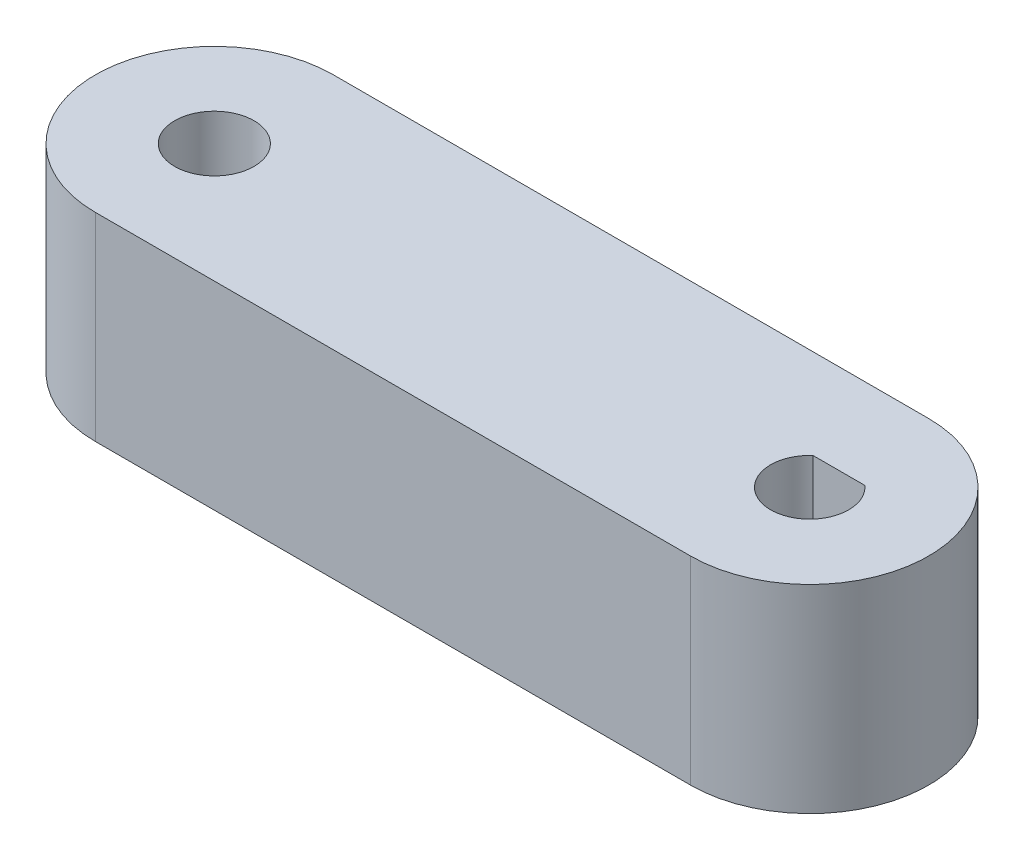
ISO-10303-21;
HEADER;
FILE_DESCRIPTION(('STEP AP214'),'2;1');
FILE_NAME('part.step','',(''),(''),'','','');
FILE_SCHEMA(('AUTOMOTIVE_DESIGN { 1 0 10303 214 1 1 1 1 }'));
ENDSEC;
DATA;
#1=APPLICATION_CONTEXT('core data for automotive mechanical design processes');
#2=APPLICATION_PROTOCOL_DEFINITION('international standard','automotive_design',2000,#1);
#3=PRODUCT_CONTEXT('',#1,'mechanical');
#4=PRODUCT('Part','Part','',(#3));
#5=PRODUCT_RELATED_PRODUCT_CATEGORY('part','',(#4));
#6=PRODUCT_DEFINITION_FORMATION('','',#4);
#7=PRODUCT_DEFINITION_CONTEXT('part definition',#1,'design');
#8=PRODUCT_DEFINITION('design','',#6,#7);
#9=PRODUCT_DEFINITION_SHAPE('','',#8);
#10=(LENGTH_UNIT() NAMED_UNIT(*) SI_UNIT(.MILLI.,.METRE.));
#11=(NAMED_UNIT(*) PLANE_ANGLE_UNIT() SI_UNIT($,.RADIAN.));
#12=(NAMED_UNIT(*) SI_UNIT($,.STERADIAN.) SOLID_ANGLE_UNIT());
#13=UNCERTAINTY_MEASURE_WITH_UNIT(LENGTH_MEASURE(1.E-05),#10,'distance_accuracy_value','');
#14=(GEOMETRIC_REPRESENTATION_CONTEXT(3) GLOBAL_UNCERTAINTY_ASSIGNED_CONTEXT((#13)) GLOBAL_UNIT_ASSIGNED_CONTEXT((#10,
#11,#12)) REPRESENTATION_CONTEXT('',''));
#15=CARTESIAN_POINT('',(0.,0.,0.));
#16=DIRECTION('',(0.,0.,1.));
#17=DIRECTION('',(1.,0.,0.));
#18=AXIS2_PLACEMENT_3D('',#15,#16,#17);
#19=CARTESIAN_POINT('',(-31.75,12.7,0.));
#20=DIRECTION('',(0.,1.,0.));
#21=DIRECTION('',(0.,0.,1.));
#22=AXIS2_PLACEMENT_3D('',#19,#20,#21);
#23=PLANE('',#22);
#24=CARTESIAN_POINT('',(-31.75,12.7,0.));
#25=DIRECTION('',(0.,1.,0.));
#26=DIRECTION('',(0.,0.,1.));
#27=AXIS2_PLACEMENT_3D('',#24,#25,#26);
#28=CIRCLE('',#27,2.54);
#29=CARTESIAN_POINT('',(-31.75,12.7,2.54));
#30=VERTEX_POINT('',#29);
#31=EDGE_CURVE('E107',#30,#30,#28,.T.);
#32=ORIENTED_EDGE('',*,*,#31,.F.);
#33=EDGE_LOOP('',(#32));
#34=FACE_BOUND('',#33,.T.);
#35=CARTESIAN_POINT('',(-31.75,12.7,0.));
#36=DIRECTION('',(0.,1.,0.));
#37=DIRECTION('',(0.,0.,1.));
#38=AXIS2_PLACEMENT_3D('',#35,#36,#37);
#39=CIRCLE('',#38,7.62);
#40=CARTESIAN_POINT('',(-31.75,12.7,-7.62));
#41=VERTEX_POINT('',#40);
#42=CARTESIAN_POINT('',(-31.75,12.7,7.62));
#43=VERTEX_POINT('',#42);
#44=EDGE_CURVE('E115',#41,#43,#39,.T.);
#45=ORIENTED_EDGE('',*,*,#44,.T.);
#46=DIRECTION('',(1.,0.,0.));
#47=VECTOR('',#46,1.);
#48=CARTESIAN_POINT('',(-31.75,12.7,7.62));
#49=LINE('',#48,#47);
#50=CARTESIAN_POINT('',(6.35,12.7,7.62));
#51=VERTEX_POINT('',#50);
#52=EDGE_CURVE('E118',#43,#51,#49,.T.);
#53=ORIENTED_EDGE('',*,*,#52,.T.);
#54=CARTESIAN_POINT('',(6.35,12.7,0.));
#55=DIRECTION('',(0.,1.,0.));
#56=DIRECTION('',(0.,0.,1.));
#57=AXIS2_PLACEMENT_3D('',#54,#55,#56);
#58=CIRCLE('',#57,7.62);
#59=CARTESIAN_POINT('',(6.35,12.7,-7.62));
#60=VERTEX_POINT('',#59);
#61=EDGE_CURVE('E121',#51,#60,#58,.T.);
#62=ORIENTED_EDGE('',*,*,#61,.T.);
#63=DIRECTION('',(-1.,0.,0.));
#64=VECTOR('',#63,1.);
#65=CARTESIAN_POINT('',(-31.75,12.7,-7.62));
#66=LINE('',#65,#64);
#67=EDGE_CURVE('E123',#60,#41,#66,.T.);
#68=ORIENTED_EDGE('',*,*,#67,.T.);
#69=EDGE_LOOP('',(#45,#53,#62,#68));
#70=FACE_BOUND('',#69,.T.);
#71=CARTESIAN_POINT('',(6.35,12.7,0.));
#72=DIRECTION('',(0.,1.,0.));
#73=DIRECTION('',(0.,0.,1.));
#74=AXIS2_PLACEMENT_3D('',#71,#72,#73);
#75=CIRCLE('',#74,2.5);
#76=CARTESIAN_POINT('',(4.69118250984175,12.7,-1.87038085275302));
#77=VERTEX_POINT('',#76);
#78=CARTESIAN_POINT('',(8.00881749015825,12.7,-1.87038085275302));
#79=VERTEX_POINT('',#78);
#80=EDGE_CURVE('E102',#77,#79,#75,.T.);
#81=ORIENTED_EDGE('',*,*,#80,.F.);
#82=DIRECTION('',(1.,0.,0.));
#83=VECTOR('',#82,1.);
#84=CARTESIAN_POINT('',(0.,12.7,-1.87038085275302));
#85=LINE('',#84,#83);
#86=EDGE_CURVE('E54',#77,#79,#85,.T.);
#87=ORIENTED_EDGE('',*,*,#86,.T.);
#88=EDGE_LOOP('',(#81,#87));
#89=FACE_BOUND('',#88,.T.);
#90=ADVANCED_FACE('F39',(#34,#70,#89),#23,.T.);
#91=CARTESIAN_POINT('',(-31.75,0.,0.));
#92=DIRECTION('',(0.,1.,0.));
#93=DIRECTION('',(0.,0.,1.));
#94=AXIS2_PLACEMENT_3D('',#91,#92,#93);
#95=PLANE('',#94);
#96=CARTESIAN_POINT('',(-31.75,0.,0.));
#97=DIRECTION('',(0.,1.,0.));
#98=DIRECTION('',(0.,0.,1.));
#99=AXIS2_PLACEMENT_3D('',#96,#97,#98);
#100=CIRCLE('',#99,7.62);
#101=CARTESIAN_POINT('',(-31.75,0.,-7.62));
#102=VERTEX_POINT('',#101);
#103=CARTESIAN_POINT('',(-31.75,0.,7.62));
#104=VERTEX_POINT('',#103);
#105=EDGE_CURVE('E112',#102,#104,#100,.T.);
#106=ORIENTED_EDGE('',*,*,#105,.F.);
#107=DIRECTION('',(-1.,0.,0.));
#108=VECTOR('',#107,1.);
#109=CARTESIAN_POINT('',(-31.75,0.,-7.62));
#110=LINE('',#109,#108);
#111=CARTESIAN_POINT('',(6.35,0.,-7.62));
#112=VERTEX_POINT('',#111);
#113=EDGE_CURVE('E119',#112,#102,#110,.T.);
#114=ORIENTED_EDGE('',*,*,#113,.F.);
#115=CARTESIAN_POINT('',(6.35,0.,0.));
#116=DIRECTION('',(0.,1.,0.));
#117=DIRECTION('',(0.,0.,1.));
#118=AXIS2_PLACEMENT_3D('',#115,#116,#117);
#119=CIRCLE('',#118,7.62);
#120=CARTESIAN_POINT('',(6.35,0.,7.62));
#121=VERTEX_POINT('',#120);
#122=EDGE_CURVE('E130',#121,#112,#119,.T.);
#123=ORIENTED_EDGE('',*,*,#122,.F.);
#124=DIRECTION('',(1.,0.,0.));
#125=VECTOR('',#124,1.);
#126=CARTESIAN_POINT('',(-31.75,0.,7.62));
#127=LINE('',#126,#125);
#128=EDGE_CURVE('E128',#104,#121,#127,.T.);
#129=ORIENTED_EDGE('',*,*,#128,.F.);
#130=EDGE_LOOP('',(#106,#114,#123,#129));
#131=FACE_BOUND('',#130,.T.);
#132=CARTESIAN_POINT('',(-31.75,0.,0.));
#133=DIRECTION('',(0.,1.,0.));
#134=DIRECTION('',(0.,0.,1.));
#135=AXIS2_PLACEMENT_3D('',#132,#133,#134);
#136=CIRCLE('',#135,2.54);
#137=CARTESIAN_POINT('',(-31.75,0.,2.54));
#138=VERTEX_POINT('',#137);
#139=EDGE_CURVE('E109',#138,#138,#136,.T.);
#140=ORIENTED_EDGE('',*,*,#139,.T.);
#141=EDGE_LOOP('',(#140));
#142=FACE_BOUND('',#141,.T.);
#143=DIRECTION('',(1.,0.,0.));
#144=VECTOR('',#143,1.);
#145=CARTESIAN_POINT('',(0.,0.,-1.87038085275302));
#146=LINE('',#145,#144);
#147=CARTESIAN_POINT('',(4.69118250984175,0.,-1.87038085275302));
#148=VERTEX_POINT('',#147);
#149=CARTESIAN_POINT('',(8.00881749015825,0.,-1.87038085275302));
#150=VERTEX_POINT('',#149);
#151=EDGE_CURVE('E93',#148,#150,#146,.T.);
#152=ORIENTED_EDGE('',*,*,#151,.F.);
#153=CARTESIAN_POINT('',(6.35,0.,0.));
#154=DIRECTION('',(0.,1.,0.));
#155=DIRECTION('',(0.,0.,1.));
#156=AXIS2_PLACEMENT_3D('',#153,#154,#155);
#157=CIRCLE('',#156,2.5);
#158=EDGE_CURVE('E96',#148,#150,#157,.T.);
#159=ORIENTED_EDGE('',*,*,#158,.T.);
#160=EDGE_LOOP('',(#152,#159));
#161=FACE_BOUND('',#160,.T.);
#162=ADVANCED_FACE('F101',(#131,#142,#161),#95,.F.);
#163=CARTESIAN_POINT('',(-31.75,12.7,0.));
#164=DIRECTION('',(0.,-1.,0.));
#165=DIRECTION('',(0.,0.,-1.));
#166=AXIS2_PLACEMENT_3D('',#163,#164,#165);
#167=CYLINDRICAL_SURFACE('',#166,7.62);
#168=ORIENTED_EDGE('',*,*,#105,.T.);
#169=DIRECTION('',(0.,-1.,0.));
#170=VECTOR('',#169,1.);
#171=CARTESIAN_POINT('',(-31.75,12.7,7.62));
#172=LINE('',#171,#170);
#173=EDGE_CURVE('E11',#43,#104,#172,.T.);
#174=ORIENTED_EDGE('',*,*,#173,.F.);
#175=ORIENTED_EDGE('',*,*,#44,.F.);
#176=DIRECTION('',(0.,-1.,0.));
#177=VECTOR('',#176,1.);
#178=CARTESIAN_POINT('',(-31.75,12.7,-7.62));
#179=LINE('',#178,#177);
#180=EDGE_CURVE('E125',#41,#102,#179,.T.);
#181=ORIENTED_EDGE('',*,*,#180,.T.);
#182=EDGE_LOOP('',(#168,#174,#175,#181));
#183=FACE_BOUND('',#182,.T.);
#184=ADVANCED_FACE('F41',(#183),#167,.T.);
#185=CARTESIAN_POINT('',(-31.75,12.7,7.62));
#186=DIRECTION('',(0.,0.,-1.));
#187=DIRECTION('',(-1.,0.,0.));
#188=AXIS2_PLACEMENT_3D('',#185,#186,#187);
#189=PLANE('',#188);
#190=ORIENTED_EDGE('',*,*,#128,.T.);
#191=DIRECTION('',(0.,-1.,0.));
#192=VECTOR('',#191,1.);
#193=CARTESIAN_POINT('',(6.35,12.7,7.62));
#194=LINE('',#193,#192);
#195=EDGE_CURVE('E47',#51,#121,#194,.T.);
#196=ORIENTED_EDGE('',*,*,#195,.F.);
#197=ORIENTED_EDGE('',*,*,#52,.F.);
#198=ORIENTED_EDGE('',*,*,#173,.T.);
#199=EDGE_LOOP('',(#190,#196,#197,#198));
#200=FACE_BOUND('',#199,.T.);
#201=ADVANCED_FACE('F158',(#200),#189,.F.);
#202=CARTESIAN_POINT('',(6.35,12.7,0.));
#203=DIRECTION('',(0.,-1.,0.));
#204=DIRECTION('',(0.,0.,-1.));
#205=AXIS2_PLACEMENT_3D('',#202,#203,#204);
#206=CYLINDRICAL_SURFACE('',#205,7.62);
#207=ORIENTED_EDGE('',*,*,#122,.T.);
#208=DIRECTION('',(0.,-1.,0.));
#209=VECTOR('',#208,1.);
#210=CARTESIAN_POINT('',(6.35,12.7,-7.62));
#211=LINE('',#210,#209);
#212=EDGE_CURVE('E135',#60,#112,#211,.T.);
#213=ORIENTED_EDGE('',*,*,#212,.F.);
#214=ORIENTED_EDGE('',*,*,#61,.F.);
#215=ORIENTED_EDGE('',*,*,#195,.T.);
#216=EDGE_LOOP('',(#207,#213,#214,#215));
#217=FACE_BOUND('',#216,.T.);
#218=ADVANCED_FACE('F142',(#217),#206,.T.);
#219=CARTESIAN_POINT('',(-31.75,12.7,-7.62));
#220=DIRECTION('',(0.,0.,1.));
#221=DIRECTION('',(1.,0.,0.));
#222=AXIS2_PLACEMENT_3D('',#219,#220,#221);
#223=PLANE('',#222);
#224=ORIENTED_EDGE('',*,*,#113,.T.);
#225=ORIENTED_EDGE('',*,*,#180,.F.);
#226=ORIENTED_EDGE('',*,*,#67,.F.);
#227=ORIENTED_EDGE('',*,*,#212,.T.);
#228=EDGE_LOOP('',(#224,#225,#226,#227));
#229=FACE_BOUND('',#228,.T.);
#230=ADVANCED_FACE('F151',(#229),#223,.F.);
#231=CARTESIAN_POINT('',(-31.75,0.,0.));
#232=DIRECTION('',(0.,1.,0.));
#233=DIRECTION('',(0.,0.,1.));
#234=AXIS2_PLACEMENT_3D('',#231,#232,#233);
#235=CYLINDRICAL_SURFACE('',#234,2.54);
#236=ORIENTED_EDGE('',*,*,#139,.F.);
#237=EDGE_LOOP('',(#236));
#238=FACE_BOUND('',#237,.T.);
#239=ORIENTED_EDGE('',*,*,#31,.T.);
#240=EDGE_LOOP('',(#239));
#241=FACE_BOUND('',#240,.T.);
#242=ADVANCED_FACE('F175',(#238,#241),#235,.F.);
#243=CARTESIAN_POINT('',(0.,0.,-1.87038085275302));
#244=DIRECTION('',(0.,0.,1.));
#245=DIRECTION('',(1.,0.,0.));
#246=AXIS2_PLACEMENT_3D('',#243,#244,#245);
#247=PLANE('',#246);
#248=ORIENTED_EDGE('',*,*,#86,.F.);
#249=DIRECTION('',(0.,1.,0.));
#250=VECTOR('',#249,1.);
#251=CARTESIAN_POINT('',(4.69118250984175,0.,-1.87038085275302));
#252=LINE('',#251,#250);
#253=EDGE_CURVE('E90',#148,#77,#252,.T.);
#254=ORIENTED_EDGE('',*,*,#253,.F.);
#255=ORIENTED_EDGE('',*,*,#151,.T.);
#256=DIRECTION('',(0.,1.,0.));
#257=VECTOR('',#256,1.);
#258=CARTESIAN_POINT('',(8.00881749015825,0.,-1.87038085275302));
#259=LINE('',#258,#257);
#260=EDGE_CURVE('E61',#150,#79,#259,.T.);
#261=ORIENTED_EDGE('',*,*,#260,.T.);
#262=EDGE_LOOP('',(#248,#254,#255,#261));
#263=FACE_BOUND('',#262,.T.);
#264=ADVANCED_FACE('F91',(#263),#247,.T.);
#265=CARTESIAN_POINT('',(6.35,0.,0.));
#266=DIRECTION('',(0.,1.,0.));
#267=DIRECTION('',(0.,0.,1.));
#268=AXIS2_PLACEMENT_3D('',#265,#266,#267);
#269=CYLINDRICAL_SURFACE('',#268,2.5);
#270=ORIENTED_EDGE('',*,*,#80,.T.);
#271=ORIENTED_EDGE('',*,*,#260,.F.);
#272=ORIENTED_EDGE('',*,*,#158,.F.);
#273=ORIENTED_EDGE('',*,*,#253,.T.);
#274=EDGE_LOOP('',(#270,#271,#272,#273));
#275=FACE_BOUND('',#274,.T.);
#276=ADVANCED_FACE('F98',(#275),#269,.F.);
#277=CLOSED_SHELL('',(#90,#162,#184,#201,#218,#230,#242,#264,#276));
#278=MANIFOLD_SOLID_BREP('B2',#277);
#279=ADVANCED_BREP_SHAPE_REPRESENTATION('',(#18,#278),#14);
#280=SHAPE_DEFINITION_REPRESENTATION(#9,#279);
ENDSEC;
END-ISO-10303-21;
